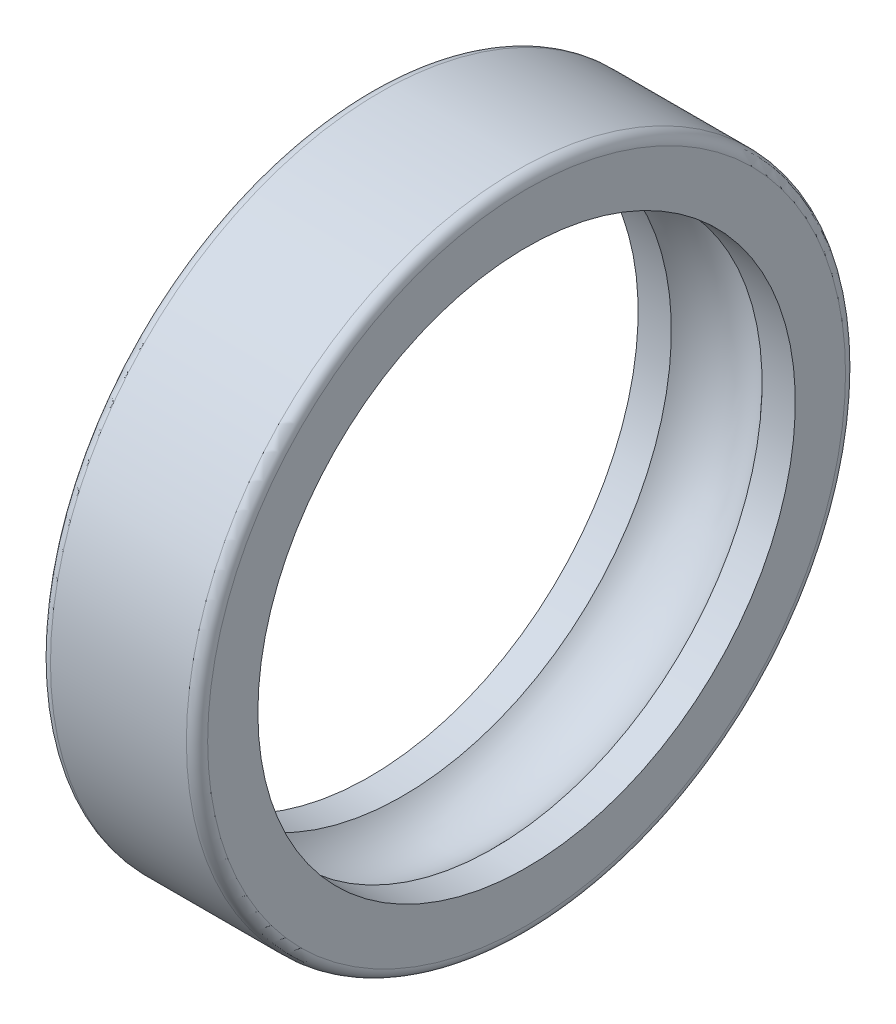
ISO-10303-21;
HEADER;
FILE_DESCRIPTION(('STEP AP214'),'2;1');
FILE_NAME('part.step','',(''),(''),'','','');
FILE_SCHEMA(('AUTOMOTIVE_DESIGN { 1 0 10303 214 1 1 1 1 }'));
ENDSEC;
DATA;
#1=APPLICATION_CONTEXT('core data for automotive mechanical design processes');
#2=APPLICATION_PROTOCOL_DEFINITION('international standard','automotive_design',2000,#1);
#3=PRODUCT_CONTEXT('',#1,'mechanical');
#4=PRODUCT('Part','Part','',(#3));
#5=PRODUCT_RELATED_PRODUCT_CATEGORY('part','',(#4));
#6=PRODUCT_DEFINITION_FORMATION('','',#4);
#7=PRODUCT_DEFINITION_CONTEXT('part definition',#1,'design');
#8=PRODUCT_DEFINITION('design','',#6,#7);
#9=PRODUCT_DEFINITION_SHAPE('','',#8);
#10=(LENGTH_UNIT() NAMED_UNIT(*) SI_UNIT(.MILLI.,.METRE.));
#11=(NAMED_UNIT(*) PLANE_ANGLE_UNIT() SI_UNIT($,.RADIAN.));
#12=(NAMED_UNIT(*) SI_UNIT($,.STERADIAN.) SOLID_ANGLE_UNIT());
#13=UNCERTAINTY_MEASURE_WITH_UNIT(LENGTH_MEASURE(1.E-05),#10,'distance_accuracy_value','');
#14=(GEOMETRIC_REPRESENTATION_CONTEXT(3) GLOBAL_UNCERTAINTY_ASSIGNED_CONTEXT((#13)) GLOBAL_UNIT_ASSIGNED_CONTEXT((#10,
#11,#12)) REPRESENTATION_CONTEXT('',''));
#15=CARTESIAN_POINT('',(0.,0.,0.));
#16=DIRECTION('',(0.,0.,1.));
#17=DIRECTION('',(1.,0.,0.));
#18=AXIS2_PLACEMENT_3D('',#15,#16,#17);
#19=CARTESIAN_POINT('',(0.,0.,0.));
#20=DIRECTION('',(-1.,0.,0.));
#21=DIRECTION('',(0.,0.,1.));
#22=AXIS2_PLACEMENT_3D('',#19,#20,#21);
#23=CYLINDRICAL_SURFACE('',#22,65.);
#24=CARTESIAN_POINT('',(-13.4,0.,0.));
#25=DIRECTION('',(1.,0.,0.));
#26=DIRECTION('',(0.,0.,-1.));
#27=AXIS2_PLACEMENT_3D('',#24,#25,#26);
#28=CIRCLE('',#27,65.);
#29=CARTESIAN_POINT('',(-13.4,0.,-65.));
#30=VERTEX_POINT('',#29);
#31=EDGE_CURVE('E41',#30,#30,#28,.T.);
#32=ORIENTED_EDGE('',*,*,#31,.T.);
#33=EDGE_LOOP('',(#32));
#34=FACE_BOUND('',#33,.T.);
#35=CARTESIAN_POINT('',(13.4,0.,0.));
#36=DIRECTION('',(1.,0.,0.));
#37=DIRECTION('',(0.,0.,-1.));
#38=AXIS2_PLACEMENT_3D('',#35,#36,#37);
#39=CIRCLE('',#38,65.);
#40=CARTESIAN_POINT('',(13.4,0.,-65.));
#41=VERTEX_POINT('',#40);
#42=EDGE_CURVE('E45',#41,#41,#39,.F.);
#43=ORIENTED_EDGE('',*,*,#42,.T.);
#44=EDGE_LOOP('',(#43));
#45=FACE_BOUND('',#44,.T.);
#46=ADVANCED_FACE('F34',(#34,#45),#23,.T.);
#47=CARTESIAN_POINT('',(15.5,65.,0.));
#48=DIRECTION('',(1.,0.,0.));
#49=DIRECTION('',(0.,0.,-1.));
#50=AXIS2_PLACEMENT_3D('',#47,#48,#49);
#51=PLANE('',#50);
#52=CARTESIAN_POINT('',(15.5,0.,0.));
#53=DIRECTION('',(1.,0.,0.));
#54=DIRECTION('',(0.,0.,-1.));
#55=AXIS2_PLACEMENT_3D('',#52,#53,#54);
#56=CIRCLE('',#55,62.9);
#57=CARTESIAN_POINT('',(15.5,0.,-62.9));
#58=VERTEX_POINT('',#57);
#59=EDGE_CURVE('E10',#58,#58,#56,.T.);
#60=ORIENTED_EDGE('',*,*,#59,.T.);
#61=EDGE_LOOP('',(#60));
#62=FACE_BOUND('',#61,.T.);
#63=CARTESIAN_POINT('',(15.5,0.,0.));
#64=DIRECTION('',(-1.,0.,0.));
#65=DIRECTION('',(0.,0.,1.));
#66=AXIS2_PLACEMENT_3D('',#63,#64,#65);
#67=CIRCLE('',#66,53.);
#68=CARTESIAN_POINT('',(15.5,0.,53.));
#69=VERTEX_POINT('',#68);
#70=EDGE_CURVE('E54',#69,#69,#67,.T.);
#71=ORIENTED_EDGE('',*,*,#70,.T.);
#72=EDGE_LOOP('',(#71));
#73=FACE_BOUND('',#72,.T.);
#74=ADVANCED_FACE('F83',(#62,#73),#51,.T.);
#75=CARTESIAN_POINT('',(0.,0.,0.));
#76=DIRECTION('',(-1.,0.,0.));
#77=DIRECTION('',(0.,0.,1.));
#78=AXIS2_PLACEMENT_3D('',#75,#76,#77);
#79=CYLINDRICAL_SURFACE('',#78,53.);
#80=ORIENTED_EDGE('',*,*,#70,.F.);
#81=EDGE_LOOP('',(#80));
#82=FACE_BOUND('',#81,.T.);
#83=CARTESIAN_POINT('',(8.94427190999916,0.,0.));
#84=DIRECTION('',(-1.,0.,0.));
#85=DIRECTION('',(0.,0.,1.));
#86=AXIS2_PLACEMENT_3D('',#83,#84,#85);
#87=CIRCLE('',#86,53.);
#88=CARTESIAN_POINT('',(8.94427190999916,0.,53.));
#89=VERTEX_POINT('',#88);
#90=EDGE_CURVE('E57',#89,#89,#87,.T.);
#91=ORIENTED_EDGE('',*,*,#90,.T.);
#92=EDGE_LOOP('',(#91));
#93=FACE_BOUND('',#92,.T.);
#94=ADVANCED_FACE('F88',(#82,#93),#79,.F.);
#95=CARTESIAN_POINT('',(0.,0.,0.));
#96=DIRECTION('',(-1.,0.,0.));
#97=DIRECTION('',(0.,0.,1.));
#98=AXIS2_PLACEMENT_3D('',#95,#96,#97);
#99=TOROIDAL_SURFACE('',#98,45.,12.);
#100=ORIENTED_EDGE('',*,*,#90,.F.);
#101=EDGE_LOOP('',(#100));
#102=FACE_BOUND('',#101,.T.);
#103=CARTESIAN_POINT('',(-8.94427190999916,0.,0.));
#104=DIRECTION('',(-1.,0.,0.));
#105=DIRECTION('',(0.,0.,1.));
#106=AXIS2_PLACEMENT_3D('',#103,#104,#105);
#107=CIRCLE('',#106,53.);
#108=CARTESIAN_POINT('',(-8.94427190999916,0.,53.));
#109=VERTEX_POINT('',#108);
#110=EDGE_CURVE('E60',#109,#109,#107,.T.);
#111=ORIENTED_EDGE('',*,*,#110,.T.);
#112=EDGE_LOOP('',(#111));
#113=FACE_BOUND('',#112,.T.);
#114=ADVANCED_FACE('F79',(#102,#113),#99,.F.);
#115=CARTESIAN_POINT('',(0.,0.,0.));
#116=DIRECTION('',(-1.,0.,0.));
#117=DIRECTION('',(0.,0.,1.));
#118=AXIS2_PLACEMENT_3D('',#115,#116,#117);
#119=CYLINDRICAL_SURFACE('',#118,53.);
#120=ORIENTED_EDGE('',*,*,#110,.F.);
#121=EDGE_LOOP('',(#120));
#122=FACE_BOUND('',#121,.T.);
#123=CARTESIAN_POINT('',(-15.5,0.,0.));
#124=DIRECTION('',(-1.,0.,0.));
#125=DIRECTION('',(0.,0.,1.));
#126=AXIS2_PLACEMENT_3D('',#123,#124,#125);
#127=CIRCLE('',#126,53.);
#128=CARTESIAN_POINT('',(-15.5,0.,53.));
#129=VERTEX_POINT('',#128);
#130=EDGE_CURVE('E63',#129,#129,#127,.T.);
#131=ORIENTED_EDGE('',*,*,#130,.T.);
#132=EDGE_LOOP('',(#131));
#133=FACE_BOUND('',#132,.T.);
#134=ADVANCED_FACE('F67',(#122,#133),#119,.F.);
#135=CARTESIAN_POINT('',(-15.5,65.,0.));
#136=DIRECTION('',(1.,0.,0.));
#137=DIRECTION('',(0.,0.,-1.));
#138=AXIS2_PLACEMENT_3D('',#135,#136,#137);
#139=PLANE('',#138);
#140=CARTESIAN_POINT('',(-15.5,0.,0.));
#141=DIRECTION('',(1.,0.,0.));
#142=DIRECTION('',(0.,0.,-1.));
#143=AXIS2_PLACEMENT_3D('',#140,#141,#142);
#144=CIRCLE('',#143,62.9);
#145=CARTESIAN_POINT('',(-15.5,0.,-62.9));
#146=VERTEX_POINT('',#145);
#147=EDGE_CURVE('E49',#146,#146,#144,.F.);
#148=ORIENTED_EDGE('',*,*,#147,.T.);
#149=EDGE_LOOP('',(#148));
#150=FACE_BOUND('',#149,.T.);
#151=ORIENTED_EDGE('',*,*,#130,.F.);
#152=EDGE_LOOP('',(#151));
#153=FACE_BOUND('',#152,.T.);
#154=ADVANCED_FACE('F69',(#150,#153),#139,.F.);
#155=CARTESIAN_POINT('',(-13.4,0.,0.));
#156=DIRECTION('',(1.,0.,0.));
#157=DIRECTION('',(0.,0.,-1.));
#158=AXIS2_PLACEMENT_3D('',#155,#156,#157);
#159=TOROIDAL_SURFACE('',#158,62.9,2.1);
#160=ORIENTED_EDGE('',*,*,#31,.F.);
#161=EDGE_LOOP('',(#160));
#162=FACE_BOUND('',#161,.T.);
#163=ORIENTED_EDGE('',*,*,#147,.F.);
#164=EDGE_LOOP('',(#163));
#165=FACE_BOUND('',#164,.T.);
#166=ADVANCED_FACE('F71',(#162,#165),#159,.T.);
#167=CARTESIAN_POINT('',(13.4,0.,0.));
#168=DIRECTION('',(1.,0.,0.));
#169=DIRECTION('',(0.,0.,-1.));
#170=AXIS2_PLACEMENT_3D('',#167,#168,#169);
#171=TOROIDAL_SURFACE('',#170,62.9,2.1);
#172=ORIENTED_EDGE('',*,*,#59,.F.);
#173=EDGE_LOOP('',(#172));
#174=FACE_BOUND('',#173,.T.);
#175=ORIENTED_EDGE('',*,*,#42,.F.);
#176=EDGE_LOOP('',(#175));
#177=FACE_BOUND('',#176,.T.);
#178=ADVANCED_FACE('F36',(#174,#177),#171,.T.);
#179=CLOSED_SHELL('',(#46,#74,#94,#114,#134,#154,#166,#178));
#180=MANIFOLD_SOLID_BREP('B2',#179);
#181=ADVANCED_BREP_SHAPE_REPRESENTATION('',(#18,#180),#14);
#182=SHAPE_DEFINITION_REPRESENTATION(#9,#181);
ENDSEC;
END-ISO-10303-21;
